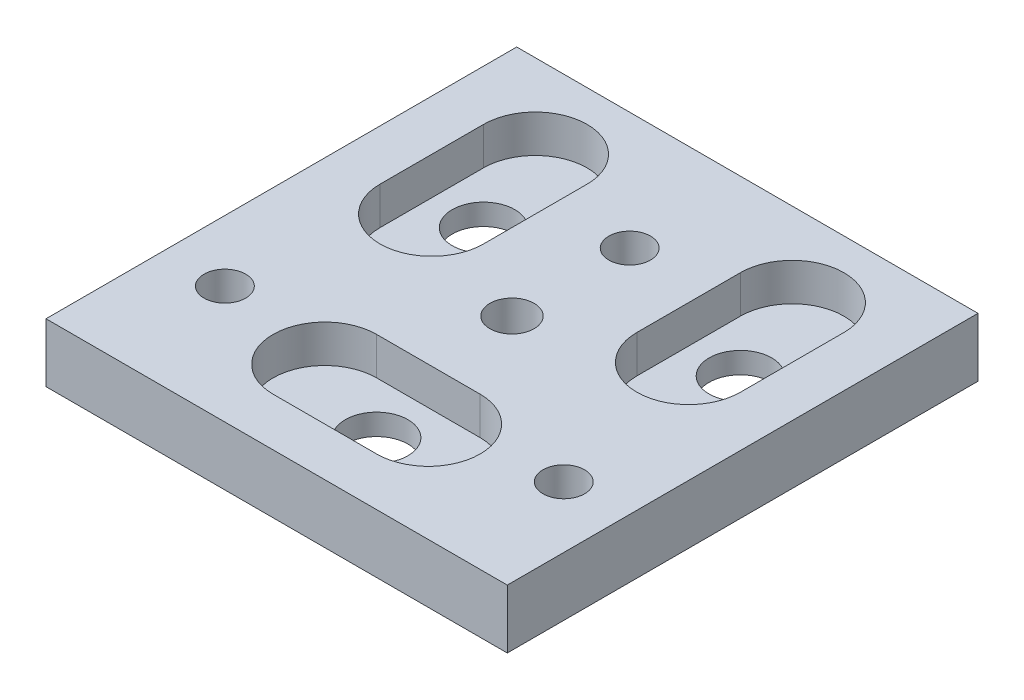
ISO-10303-21;
HEADER;
FILE_DESCRIPTION(('STEP AP214'),'2;1');
FILE_NAME('part.step','',(''),(''),'','','');
FILE_SCHEMA(('AUTOMOTIVE_DESIGN { 1 0 10303 214 1 1 1 1 }'));
ENDSEC;
DATA;
#1=APPLICATION_CONTEXT('core data for automotive mechanical design processes');
#2=APPLICATION_PROTOCOL_DEFINITION('international standard','automotive_design',2000,#1);
#3=PRODUCT_CONTEXT('',#1,'mechanical');
#4=PRODUCT('Part','Part','',(#3));
#5=PRODUCT_RELATED_PRODUCT_CATEGORY('part','',(#4));
#6=PRODUCT_DEFINITION_FORMATION('','',#4);
#7=PRODUCT_DEFINITION_CONTEXT('part definition',#1,'design');
#8=PRODUCT_DEFINITION('design','',#6,#7);
#9=PRODUCT_DEFINITION_SHAPE('','',#8);
#10=(LENGTH_UNIT() NAMED_UNIT(*) SI_UNIT(.MILLI.,.METRE.));
#11=(NAMED_UNIT(*) PLANE_ANGLE_UNIT() SI_UNIT($,.RADIAN.));
#12=(NAMED_UNIT(*) SI_UNIT($,.STERADIAN.) SOLID_ANGLE_UNIT());
#13=UNCERTAINTY_MEASURE_WITH_UNIT(LENGTH_MEASURE(1.E-05),#10,'distance_accuracy_value','');
#14=(GEOMETRIC_REPRESENTATION_CONTEXT(3) GLOBAL_UNCERTAINTY_ASSIGNED_CONTEXT((#13)) GLOBAL_UNIT_ASSIGNED_CONTEXT((#10,
#11,#12)) REPRESENTATION_CONTEXT('',''));
#15=CARTESIAN_POINT('',(0.,0.,0.));
#16=DIRECTION('',(0.,0.,1.));
#17=DIRECTION('',(1.,0.,0.));
#18=AXIS2_PLACEMENT_3D('',#15,#16,#17);
#19=CARTESIAN_POINT('',(0.,-1.01481323344643E-13,14.61008));
#20=DIRECTION('',(0.,-1.,0.));
#21=DIRECTION('',(0.,0.,-1.));
#22=AXIS2_PLACEMENT_3D('',#19,#20,#21);
#23=CYLINDRICAL_SURFACE('',#22,3.3782);
#24=CARTESIAN_POINT('',(0.,-1.01481323344643E-13,14.61008));
#25=DIRECTION('',(0.,-1.,0.));
#26=DIRECTION('',(0.,0.,-1.));
#27=AXIS2_PLACEMENT_3D('',#24,#25,#26);
#28=CIRCLE('',#27,3.3782);
#29=CARTESIAN_POINT('',(0.,0.,11.23188));
#30=VERTEX_POINT('',#29);
#31=EDGE_CURVE('E330',#30,#30,#28,.T.);
#32=ORIENTED_EDGE('',*,*,#31,.T.);
#33=EDGE_LOOP('',(#32));
#34=FACE_BOUND('',#33,.T.);
#35=CARTESIAN_POINT('',(0.,2.2859999999999,14.61008));
#36=DIRECTION('',(0.,1.,0.));
#37=DIRECTION('',(0.,0.,1.));
#38=AXIS2_PLACEMENT_3D('',#35,#36,#37);
#39=CIRCLE('',#38,3.3782);
#40=CARTESIAN_POINT('',(0.,2.28599999999987,17.98828));
#41=VERTEX_POINT('',#40);
#42=EDGE_CURVE('E46',#41,#41,#39,.F.);
#43=ORIENTED_EDGE('',*,*,#42,.F.);
#44=EDGE_LOOP('',(#43));
#45=FACE_BOUND('',#44,.T.);
#46=ADVANCED_FACE('F42',(#34,#45),#23,.F.);
#47=CARTESIAN_POINT('',(-24.892,-1.76074432811646E-13,25.4));
#48=DIRECTION('',(1.,0.,0.));
#49=DIRECTION('',(0.,0.,1.));
#50=AXIS2_PLACEMENT_3D('',#47,#48,#49);
#51=PLANE('',#50);
#52=DIRECTION('',(0.,0.,-1.));
#53=VECTOR('',#52,1.);
#54=CARTESIAN_POINT('',(-24.892,6.34999999999982,25.4));
#55=LINE('',#54,#53);
#56=CARTESIAN_POINT('',(-24.892,6.34999999999982,25.4));
#57=VERTEX_POINT('',#56);
#58=CARTESIAN_POINT('',(-24.892,6.35000000000018,-25.4));
#59=VERTEX_POINT('',#58);
#60=EDGE_CURVE('E371',#57,#59,#55,.T.);
#61=ORIENTED_EDGE('',*,*,#60,.T.);
#62=DIRECTION('',(0.,1.,0.));
#63=VECTOR('',#62,1.);
#64=CARTESIAN_POINT('',(-24.892,1.77809156287623E-13,-25.4));
#65=LINE('',#64,#63);
#66=CARTESIAN_POINT('',(-24.892,1.77809156287623E-13,-25.4));
#67=VERTEX_POINT('',#66);
#68=EDGE_CURVE('E12',#67,#59,#65,.T.);
#69=ORIENTED_EDGE('',*,*,#68,.F.);
#70=DIRECTION('',(0.,0.,-1.));
#71=VECTOR('',#70,1.);
#72=CARTESIAN_POINT('',(-24.892,-1.76074432811646E-13,25.4));
#73=LINE('',#72,#71);
#74=CARTESIAN_POINT('',(-24.892,-1.76074432811646E-13,25.4));
#75=VERTEX_POINT('',#74);
#76=EDGE_CURVE('E372',#75,#67,#73,.T.);
#77=ORIENTED_EDGE('',*,*,#76,.F.);
#78=DIRECTION('',(0.,1.,0.));
#79=VECTOR('',#78,1.);
#80=CARTESIAN_POINT('',(-24.892,-1.76074432811646E-13,25.4));
#81=LINE('',#80,#79);
#82=EDGE_CURVE('E386',#75,#57,#81,.T.);
#83=ORIENTED_EDGE('',*,*,#82,.T.);
#84=EDGE_LOOP('',(#61,#69,#77,#83));
#85=FACE_BOUND('',#84,.T.);
#86=ADVANCED_FACE('F44',(#85),#51,.F.);
#87=CARTESIAN_POINT('',(-24.892,1.77809156287623E-13,-25.4));
#88=DIRECTION('',(0.,0.,1.));
#89=DIRECTION('',(-1.,0.,0.));
#90=AXIS2_PLACEMENT_3D('',#87,#88,#89);
#91=PLANE('',#90);
#92=DIRECTION('',(1.,0.,0.));
#93=VECTOR('',#92,1.);
#94=CARTESIAN_POINT('',(-24.892,6.35000000000018,-25.4));
#95=LINE('',#94,#93);
#96=CARTESIAN_POINT('',(24.892,6.35000000000018,-25.4));
#97=VERTEX_POINT('',#96);
#98=EDGE_CURVE('E390',#59,#97,#95,.T.);
#99=ORIENTED_EDGE('',*,*,#98,.T.);
#100=DIRECTION('',(0.,1.,0.));
#101=VECTOR('',#100,1.);
#102=CARTESIAN_POINT('',(24.892,1.77809156287623E-13,-25.4));
#103=LINE('',#102,#101);
#104=CARTESIAN_POINT('',(24.892,1.77809156287623E-13,-25.4));
#105=VERTEX_POINT('',#104);
#106=EDGE_CURVE('E52',#105,#97,#103,.T.);
#107=ORIENTED_EDGE('',*,*,#106,.F.);
#108=DIRECTION('',(1.,0.,0.));
#109=VECTOR('',#108,1.);
#110=CARTESIAN_POINT('',(-24.892,1.77809156287623E-13,-25.4));
#111=LINE('',#110,#109);
#112=EDGE_CURVE('E376',#67,#105,#111,.T.);
#113=ORIENTED_EDGE('',*,*,#112,.F.);
#114=ORIENTED_EDGE('',*,*,#68,.T.);
#115=EDGE_LOOP('',(#99,#107,#113,#114));
#116=FACE_BOUND('',#115,.T.);
#117=ADVANCED_FACE('F440',(#116),#91,.F.);
#118=CARTESIAN_POINT('',(24.892,-1.76074432811646E-13,25.4));
#119=DIRECTION('',(-1.,0.,0.));
#120=DIRECTION('',(0.,0.,-1.));
#121=AXIS2_PLACEMENT_3D('',#118,#119,#120);
#122=PLANE('',#121);
#123=DIRECTION('',(0.,0.,1.));
#124=VECTOR('',#123,1.);
#125=CARTESIAN_POINT('',(24.892,6.34999999999982,25.4));
#126=LINE('',#125,#124);
#127=CARTESIAN_POINT('',(24.892,6.34999999999982,25.4));
#128=VERTEX_POINT('',#127);
#129=EDGE_CURVE('E393',#97,#128,#126,.T.);
#130=ORIENTED_EDGE('',*,*,#129,.T.);
#131=DIRECTION('',(0.,1.,0.));
#132=VECTOR('',#131,1.);
#133=CARTESIAN_POINT('',(24.892,-1.76074432811646E-13,25.4));
#134=LINE('',#133,#132);
#135=CARTESIAN_POINT('',(24.892,-1.76074432811646E-13,25.4));
#136=VERTEX_POINT('',#135);
#137=EDGE_CURVE('E401',#136,#128,#134,.T.);
#138=ORIENTED_EDGE('',*,*,#137,.F.);
#139=DIRECTION('',(0.,0.,1.));
#140=VECTOR('',#139,1.);
#141=CARTESIAN_POINT('',(24.892,-1.76074432811646E-13,25.4));
#142=LINE('',#141,#140);
#143=EDGE_CURVE('E380',#105,#136,#142,.T.);
#144=ORIENTED_EDGE('',*,*,#143,.F.);
#145=ORIENTED_EDGE('',*,*,#106,.T.);
#146=EDGE_LOOP('',(#130,#138,#144,#145));
#147=FACE_BOUND('',#146,.T.);
#148=ADVANCED_FACE('F476',(#147),#122,.F.);
#149=CARTESIAN_POINT('',(-24.892,-1.76074432811646E-13,25.4));
#150=DIRECTION('',(0.,0.,-1.));
#151=DIRECTION('',(1.,0.,0.));
#152=AXIS2_PLACEMENT_3D('',#149,#150,#151);
#153=PLANE('',#152);
#154=DIRECTION('',(-1.,0.,0.));
#155=VECTOR('',#154,1.);
#156=CARTESIAN_POINT('',(-24.892,6.34999999999982,25.4));
#157=LINE('',#156,#155);
#158=EDGE_CURVE('E377',#128,#57,#157,.T.);
#159=ORIENTED_EDGE('',*,*,#158,.T.);
#160=ORIENTED_EDGE('',*,*,#82,.F.);
#161=DIRECTION('',(-1.,0.,0.));
#162=VECTOR('',#161,1.);
#163=CARTESIAN_POINT('',(-24.892,-1.76074432811646E-13,25.4));
#164=LINE('',#163,#162);
#165=EDGE_CURVE('E383',#136,#75,#164,.T.);
#166=ORIENTED_EDGE('',*,*,#165,.F.);
#167=ORIENTED_EDGE('',*,*,#137,.T.);
#168=EDGE_LOOP('',(#159,#160,#166,#167));
#169=FACE_BOUND('',#168,.T.);
#170=ADVANCED_FACE('F469',(#169),#153,.F.);
#171=CARTESIAN_POINT('',(0.,0.,0.));
#172=DIRECTION('',(0.,-1.,0.));
#173=DIRECTION('',(0.,0.,-1.));
#174=AXIS2_PLACEMENT_3D('',#171,#172,#173);
#175=PLANE('',#174);
#176=CARTESIAN_POINT('',(0.,0.,0.));
#177=DIRECTION('',(0.,-1.,0.));
#178=DIRECTION('',(0.,0.,-1.));
#179=AXIS2_PLACEMENT_3D('',#176,#177,#178);
#180=CIRCLE('',#179,2.38125);
#181=CARTESIAN_POINT('',(0.,0.,-2.38125000000002));
#182=VERTEX_POINT('',#181);
#183=EDGE_CURVE('E205',#182,#182,#180,.T.);
#184=ORIENTED_EDGE('',*,*,#183,.F.);
#185=EDGE_LOOP('',(#184));
#186=FACE_BOUND('',#185,.T.);
#187=ORIENTED_EDGE('',*,*,#31,.F.);
#188=EDGE_LOOP('',(#187));
#189=FACE_BOUND('',#188,.T.);
#190=CARTESIAN_POINT('',(-13.86078,0.,-10.78992));
#191=DIRECTION('',(0.,-1.,0.));
#192=DIRECTION('',(0.,0.,-1.));
#193=AXIS2_PLACEMENT_3D('',#190,#191,#192);
#194=CIRCLE('',#193,3.3782);
#195=CARTESIAN_POINT('',(-13.86078,0.,-14.16812));
#196=VERTEX_POINT('',#195);
#197=EDGE_CURVE('E334',#196,#196,#194,.T.);
#198=ORIENTED_EDGE('',*,*,#197,.F.);
#199=EDGE_LOOP('',(#198));
#200=FACE_BOUND('',#199,.T.);
#201=CARTESIAN_POINT('',(13.86078,0.,-10.78992));
#202=DIRECTION('',(0.,-1.,0.));
#203=DIRECTION('',(0.,0.,-1.));
#204=AXIS2_PLACEMENT_3D('',#201,#202,#203);
#205=CIRCLE('',#204,3.3782);
#206=CARTESIAN_POINT('',(13.86078,0.,-14.16812));
#207=VERTEX_POINT('',#206);
#208=EDGE_CURVE('E338',#207,#207,#205,.T.);
#209=ORIENTED_EDGE('',*,*,#208,.F.);
#210=EDGE_LOOP('',(#209));
#211=FACE_BOUND('',#210,.T.);
#212=CARTESIAN_POINT('',(-18.288,0.,12.7));
#213=DIRECTION('',(0.,-1.,0.));
#214=DIRECTION('',(0.,0.,-1.));
#215=AXIS2_PLACEMENT_3D('',#212,#213,#214);
#216=CIRCLE('',#215,2.24789999999999);
#217=CARTESIAN_POINT('',(-18.288,0.,10.4521));
#218=VERTEX_POINT('',#217);
#219=EDGE_CURVE('E342',#218,#218,#216,.T.);
#220=ORIENTED_EDGE('',*,*,#219,.F.);
#221=EDGE_LOOP('',(#220));
#222=FACE_BOUND('',#221,.T.);
#223=CARTESIAN_POINT('',(18.288,0.,12.7));
#224=DIRECTION('',(0.,-1.,0.));
#225=DIRECTION('',(0.,0.,-1.));
#226=AXIS2_PLACEMENT_3D('',#223,#224,#225);
#227=CIRCLE('',#226,2.24789999999999);
#228=CARTESIAN_POINT('',(18.288,0.,10.4521));
#229=VERTEX_POINT('',#228);
#230=EDGE_CURVE('E351',#229,#229,#227,.T.);
#231=ORIENTED_EDGE('',*,*,#230,.F.);
#232=EDGE_LOOP('',(#231));
#233=FACE_BOUND('',#232,.T.);
#234=CARTESIAN_POINT('',(0.,0.,-12.7));
#235=DIRECTION('',(0.,-1.,0.));
#236=DIRECTION('',(0.,0.,-1.));
#237=AXIS2_PLACEMENT_3D('',#234,#235,#236);
#238=CIRCLE('',#237,2.24789999999999);
#239=CARTESIAN_POINT('',(0.,1.04167899077988E-13,-14.9479));
#240=VERTEX_POINT('',#239);
#241=EDGE_CURVE('E363',#240,#240,#238,.T.);
#242=ORIENTED_EDGE('',*,*,#241,.F.);
#243=EDGE_LOOP('',(#242));
#244=FACE_BOUND('',#243,.T.);
#245=ORIENTED_EDGE('',*,*,#76,.T.);
#246=ORIENTED_EDGE('',*,*,#112,.T.);
#247=ORIENTED_EDGE('',*,*,#143,.T.);
#248=ORIENTED_EDGE('',*,*,#165,.T.);
#249=EDGE_LOOP('',(#245,#246,#247,#248));
#250=FACE_BOUND('',#249,.T.);
#251=ADVANCED_FACE('F466',(#186,#189,#200,#211,#222,#233,#244,#250),#175,.T.);
#252=CARTESIAN_POINT('',(0.,6.35,0.));
#253=DIRECTION('',(0.,-1.,0.));
#254=DIRECTION('',(0.,0.,-1.));
#255=AXIS2_PLACEMENT_3D('',#252,#253,#254);
#256=PLANE('',#255);
#257=CARTESIAN_POINT('',(0.,6.35,0.));
#258=DIRECTION('',(0.,-1.,0.));
#259=DIRECTION('',(0.,0.,-1.));
#260=AXIS2_PLACEMENT_3D('',#257,#258,#259);
#261=CIRCLE('',#260,2.38125);
#262=CARTESIAN_POINT('',(0.,6.35000000000002,-2.38124999999998));
#263=VERTEX_POINT('',#262);
#264=EDGE_CURVE('E215',#263,#263,#261,.T.);
#265=ORIENTED_EDGE('',*,*,#264,.T.);
#266=EDGE_LOOP('',(#265));
#267=FACE_BOUND('',#266,.T.);
#268=DIRECTION('',(1.,0.,0.));
#269=VECTOR('',#268,1.);
#270=CARTESIAN_POINT('',(-5.588,6.34999999999986,20.19808));
#271=LINE('',#270,#269);
#272=CARTESIAN_POINT('',(-5.588,6.34999999999986,20.19808));
#273=VERTEX_POINT('',#272);
#274=CARTESIAN_POINT('',(5.588,6.34999999999986,20.19808));
#275=VERTEX_POINT('',#274);
#276=EDGE_CURVE('E214',#273,#275,#271,.T.);
#277=ORIENTED_EDGE('',*,*,#276,.F.);
#278=CARTESIAN_POINT('',(-5.588,6.3499999999999,14.61008));
#279=DIRECTION('',(0.,1.,0.));
#280=DIRECTION('',(0.,0.,1.));
#281=AXIS2_PLACEMENT_3D('',#278,#279,#280);
#282=CIRCLE('',#281,5.588);
#283=CARTESIAN_POINT('',(-5.588,6.34999999999994,9.02208000000002));
#284=VERTEX_POINT('',#283);
#285=EDGE_CURVE('E63',#284,#273,#282,.T.);
#286=ORIENTED_EDGE('',*,*,#285,.F.);
#287=DIRECTION('',(-1.,0.,0.));
#288=VECTOR('',#287,1.);
#289=CARTESIAN_POINT('',(-5.588,6.34999999999994,9.02208000000002));
#290=LINE('',#289,#288);
#291=CARTESIAN_POINT('',(5.588,6.34999999999994,9.02208000000002));
#292=VERTEX_POINT('',#291);
#293=EDGE_CURVE('E197',#292,#284,#290,.T.);
#294=ORIENTED_EDGE('',*,*,#293,.F.);
#295=CARTESIAN_POINT('',(5.588,6.3499999999999,14.61008));
#296=DIRECTION('',(0.,1.,0.));
#297=DIRECTION('',(0.,0.,-1.));
#298=AXIS2_PLACEMENT_3D('',#295,#296,#297);
#299=CIRCLE('',#298,5.588);
#300=EDGE_CURVE('E202',#275,#292,#299,.T.);
#301=ORIENTED_EDGE('',*,*,#300,.F.);
#302=EDGE_LOOP('',(#277,#286,#294,#301));
#303=FACE_BOUND('',#302,.T.);
#304=DIRECTION('',(0.,0.,1.));
#305=VECTOR('',#304,1.);
#306=CARTESIAN_POINT('',(8.27278,6.35000000000012,-16.37792));
#307=LINE('',#306,#305);
#308=CARTESIAN_POINT('',(8.27278,6.35000000000012,-16.37792));
#309=VERTEX_POINT('',#308);
#310=CARTESIAN_POINT('',(8.27278,6.35000000000004,-5.20191999999998));
#311=VERTEX_POINT('',#310);
#312=EDGE_CURVE('E256',#309,#311,#307,.T.);
#313=ORIENTED_EDGE('',*,*,#312,.F.);
#314=CARTESIAN_POINT('',(13.86078,6.35000000000012,-16.37792));
#315=DIRECTION('',(0.,1.,0.));
#316=DIRECTION('',(0.,0.,-1.));
#317=AXIS2_PLACEMENT_3D('',#314,#315,#316);
#318=CIRCLE('',#317,5.588);
#319=CARTESIAN_POINT('',(19.44878,6.35000000000012,-16.37792));
#320=VERTEX_POINT('',#319);
#321=EDGE_CURVE('E74',#320,#309,#318,.T.);
#322=ORIENTED_EDGE('',*,*,#321,.F.);
#323=DIRECTION('',(0.,0.,-1.));
#324=VECTOR('',#323,1.);
#325=CARTESIAN_POINT('',(19.44878,6.35000000000012,-16.37792));
#326=LINE('',#325,#324);
#327=CARTESIAN_POINT('',(19.44878,6.35000000000004,-5.20191999999998));
#328=VERTEX_POINT('',#327);
#329=EDGE_CURVE('E240',#328,#320,#326,.T.);
#330=ORIENTED_EDGE('',*,*,#329,.F.);
#331=CARTESIAN_POINT('',(13.86078,6.35000000000004,-5.20191999999998));
#332=DIRECTION('',(0.,1.,0.));
#333=DIRECTION('',(0.,0.,-1.));
#334=AXIS2_PLACEMENT_3D('',#331,#332,#333);
#335=CIRCLE('',#334,5.588);
#336=EDGE_CURVE('E266',#311,#328,#335,.T.);
#337=ORIENTED_EDGE('',*,*,#336,.F.);
#338=EDGE_LOOP('',(#313,#322,#330,#337));
#339=FACE_BOUND('',#338,.T.);
#340=DIRECTION('',(0.,0.,1.));
#341=VECTOR('',#340,1.);
#342=CARTESIAN_POINT('',(-19.44878,6.35000000000012,-16.37792));
#343=LINE('',#342,#341);
#344=CARTESIAN_POINT('',(-19.44878,6.35000000000012,-16.37792));
#345=VERTEX_POINT('',#344);
#346=CARTESIAN_POINT('',(-19.44878,6.35000000000004,-5.20191999999997));
#347=VERTEX_POINT('',#346);
#348=EDGE_CURVE('E302',#345,#347,#343,.T.);
#349=ORIENTED_EDGE('',*,*,#348,.F.);
#350=CARTESIAN_POINT('',(-13.86078,6.35000000000012,-16.37792));
#351=DIRECTION('',(0.,1.,0.));
#352=DIRECTION('',(0.,0.,-1.));
#353=AXIS2_PLACEMENT_3D('',#350,#351,#352);
#354=CIRCLE('',#353,5.588);
#355=CARTESIAN_POINT('',(-8.27278,6.35000000000012,-16.37792));
#356=VERTEX_POINT('',#355);
#357=EDGE_CURVE('E298',#356,#345,#354,.T.);
#358=ORIENTED_EDGE('',*,*,#357,.F.);
#359=DIRECTION('',(0.,0.,-1.));
#360=VECTOR('',#359,1.);
#361=CARTESIAN_POINT('',(-8.27278,6.35000000000012,-16.37792));
#362=LINE('',#361,#360);
#363=CARTESIAN_POINT('',(-8.27277999999999,6.35000000000004,-5.20191999999997));
#364=VERTEX_POINT('',#363);
#365=EDGE_CURVE('E285',#364,#356,#362,.T.);
#366=ORIENTED_EDGE('',*,*,#365,.F.);
#367=CARTESIAN_POINT('',(-13.86078,6.35000000000004,-5.20191999999997));
#368=DIRECTION('',(0.,1.,0.));
#369=DIRECTION('',(0.,0.,1.));
#370=AXIS2_PLACEMENT_3D('',#367,#368,#369);
#371=CIRCLE('',#370,5.588);
#372=EDGE_CURVE('E309',#347,#364,#371,.T.);
#373=ORIENTED_EDGE('',*,*,#372,.F.);
#374=EDGE_LOOP('',(#349,#358,#366,#373));
#375=FACE_BOUND('',#374,.T.);
#376=CARTESIAN_POINT('',(-18.288,6.34999999999991,12.7));
#377=DIRECTION('',(0.,-1.,0.));
#378=DIRECTION('',(0.,0.,-1.));
#379=AXIS2_PLACEMENT_3D('',#376,#377,#378);
#380=CIRCLE('',#379,2.2479);
#381=CARTESIAN_POINT('',(-18.288,6.34999999999993,10.4521));
#382=VERTEX_POINT('',#381);
#383=EDGE_CURVE('E346',#382,#382,#380,.T.);
#384=ORIENTED_EDGE('',*,*,#383,.T.);
#385=EDGE_LOOP('',(#384));
#386=FACE_BOUND('',#385,.T.);
#387=CARTESIAN_POINT('',(18.288,6.34999999999991,12.7));
#388=DIRECTION('',(0.,-1.,0.));
#389=DIRECTION('',(0.,0.,-1.));
#390=AXIS2_PLACEMENT_3D('',#387,#388,#389);
#391=CIRCLE('',#390,2.2479);
#392=CARTESIAN_POINT('',(18.288,6.34999999999993,10.4521));
#393=VERTEX_POINT('',#392);
#394=EDGE_CURVE('E358',#393,#393,#391,.T.);
#395=ORIENTED_EDGE('',*,*,#394,.T.);
#396=EDGE_LOOP('',(#395));
#397=FACE_BOUND('',#396,.T.);
#398=CARTESIAN_POINT('',(0.,6.35000000000009,-12.7));
#399=DIRECTION('',(0.,-1.,0.));
#400=DIRECTION('',(0.,0.,-1.));
#401=AXIS2_PLACEMENT_3D('',#398,#399,#400);
#402=CIRCLE('',#401,2.2479);
#403=CARTESIAN_POINT('',(0.,6.3500000000001,-14.9479));
#404=VERTEX_POINT('',#403);
#405=EDGE_CURVE('E366',#404,#404,#402,.T.);
#406=ORIENTED_EDGE('',*,*,#405,.T.);
#407=EDGE_LOOP('',(#406));
#408=FACE_BOUND('',#407,.T.);
#409=ORIENTED_EDGE('',*,*,#60,.F.);
#410=ORIENTED_EDGE('',*,*,#158,.F.);
#411=ORIENTED_EDGE('',*,*,#129,.F.);
#412=ORIENTED_EDGE('',*,*,#98,.F.);
#413=EDGE_LOOP('',(#409,#410,#411,#412));
#414=FACE_BOUND('',#413,.T.);
#415=ADVANCED_FACE('F464',(#267,#303,#339,#375,#386,#397,#408,#414),#256,.F.);
#416=CARTESIAN_POINT('',(0.,0.,-12.7));
#417=DIRECTION('',(0.,-1.,0.));
#418=DIRECTION('',(0.,0.,-1.));
#419=AXIS2_PLACEMENT_3D('',#416,#417,#418);
#420=CYLINDRICAL_SURFACE('',#419,2.24789999999999);
#421=ORIENTED_EDGE('',*,*,#405,.F.);
#422=EDGE_LOOP('',(#421));
#423=FACE_BOUND('',#422,.T.);
#424=ORIENTED_EDGE('',*,*,#241,.T.);
#425=EDGE_LOOP('',(#424));
#426=FACE_BOUND('',#425,.T.);
#427=ADVANCED_FACE('F460',(#423,#426),#420,.F.);
#428=CARTESIAN_POINT('',(18.288,0.,12.7));
#429=DIRECTION('',(0.,-1.,0.));
#430=DIRECTION('',(0.,0.,-1.));
#431=AXIS2_PLACEMENT_3D('',#428,#429,#430);
#432=CYLINDRICAL_SURFACE('',#431,2.24789999999999);
#433=ORIENTED_EDGE('',*,*,#394,.F.);
#434=EDGE_LOOP('',(#433));
#435=FACE_BOUND('',#434,.T.);
#436=ORIENTED_EDGE('',*,*,#230,.T.);
#437=EDGE_LOOP('',(#436));
#438=FACE_BOUND('',#437,.T.);
#439=ADVANCED_FACE('F456',(#435,#438),#432,.F.);
#440=CARTESIAN_POINT('',(-18.288,0.,12.7));
#441=DIRECTION('',(0.,-1.,0.));
#442=DIRECTION('',(0.,0.,-1.));
#443=AXIS2_PLACEMENT_3D('',#440,#441,#442);
#444=CYLINDRICAL_SURFACE('',#443,2.24789999999999);
#445=ORIENTED_EDGE('',*,*,#383,.F.);
#446=EDGE_LOOP('',(#445));
#447=FACE_BOUND('',#446,.T.);
#448=ORIENTED_EDGE('',*,*,#219,.T.);
#449=EDGE_LOOP('',(#448));
#450=FACE_BOUND('',#449,.T.);
#451=ADVANCED_FACE('F453',(#447,#450),#444,.F.);
#452=CARTESIAN_POINT('',(13.86078,0.,-10.78992));
#453=DIRECTION('',(0.,-1.,0.));
#454=DIRECTION('',(0.,0.,-1.));
#455=AXIS2_PLACEMENT_3D('',#452,#453,#454);
#456=CYLINDRICAL_SURFACE('',#455,3.3782);
#457=CARTESIAN_POINT('',(13.86078,2.28600000000008,-10.78992));
#458=DIRECTION('',(0.,-1.,0.));
#459=DIRECTION('',(0.,0.,-1.));
#460=AXIS2_PLACEMENT_3D('',#457,#458,#459);
#461=CIRCLE('',#460,3.3782);
#462=CARTESIAN_POINT('',(13.86078,2.2860000000001,-14.16812));
#463=VERTEX_POINT('',#462);
#464=EDGE_CURVE('E271',#463,#463,#461,.F.);
#465=ORIENTED_EDGE('',*,*,#464,.T.);
#466=EDGE_LOOP('',(#465));
#467=FACE_BOUND('',#466,.T.);
#468=ORIENTED_EDGE('',*,*,#208,.T.);
#469=EDGE_LOOP('',(#468));
#470=FACE_BOUND('',#469,.T.);
#471=ADVANCED_FACE('F414',(#467,#470),#456,.F.);
#472=CARTESIAN_POINT('',(-13.86078,0.,-10.78992));
#473=DIRECTION('',(0.,-1.,0.));
#474=DIRECTION('',(0.,0.,-1.));
#475=AXIS2_PLACEMENT_3D('',#472,#473,#474);
#476=CYLINDRICAL_SURFACE('',#475,3.3782);
#477=CARTESIAN_POINT('',(-13.86078,2.28600000000008,-10.78992));
#478=DIRECTION('',(0.,-1.,0.));
#479=DIRECTION('',(0.,0.,-1.));
#480=AXIS2_PLACEMENT_3D('',#477,#478,#479);
#481=CIRCLE('',#480,3.3782);
#482=CARTESIAN_POINT('',(-13.86078,2.2860000000001,-14.16812));
#483=VERTEX_POINT('',#482);
#484=EDGE_CURVE('E320',#483,#483,#481,.F.);
#485=ORIENTED_EDGE('',*,*,#484,.T.);
#486=EDGE_LOOP('',(#485));
#487=FACE_BOUND('',#486,.T.);
#488=ORIENTED_EDGE('',*,*,#197,.T.);
#489=EDGE_LOOP('',(#488));
#490=FACE_BOUND('',#489,.T.);
#491=ADVANCED_FACE('F446',(#487,#490),#476,.F.);
#492=CARTESIAN_POINT('',(-13.86078,2.28600000000012,-16.37792));
#493=DIRECTION('',(0.,-1.,0.));
#494=DIRECTION('',(0.,0.,-1.));
#495=AXIS2_PLACEMENT_3D('',#492,#493,#494);
#496=PLANE('',#495);
#497=CARTESIAN_POINT('',(-13.86078,2.28600000000012,-16.37792));
#498=DIRECTION('',(0.,1.,0.));
#499=DIRECTION('',(0.,0.,-1.));
#500=AXIS2_PLACEMENT_3D('',#497,#498,#499);
#501=CIRCLE('',#500,5.588);
#502=CARTESIAN_POINT('',(-8.27278,2.28600000000012,-16.37792));
#503=VERTEX_POINT('',#502);
#504=CARTESIAN_POINT('',(-19.44878,2.28600000000012,-16.37792));
#505=VERTEX_POINT('',#504);
#506=EDGE_CURVE('E280',#503,#505,#501,.T.);
#507=ORIENTED_EDGE('',*,*,#506,.T.);
#508=DIRECTION('',(0.,0.,1.));
#509=VECTOR('',#508,1.);
#510=CARTESIAN_POINT('',(-19.44878,2.28600000000012,-16.37792));
#511=LINE('',#510,#509);
#512=CARTESIAN_POINT('',(-19.44878,2.28600000000004,-5.20192));
#513=VERTEX_POINT('',#512);
#514=EDGE_CURVE('E284',#505,#513,#511,.T.);
#515=ORIENTED_EDGE('',*,*,#514,.T.);
#516=CARTESIAN_POINT('',(-13.86078,2.28600000000004,-5.20192));
#517=DIRECTION('',(0.,1.,0.));
#518=DIRECTION('',(0.,0.,1.));
#519=AXIS2_PLACEMENT_3D('',#516,#517,#518);
#520=CIRCLE('',#519,5.588);
#521=CARTESIAN_POINT('',(-8.27277999999999,2.28600000000004,-5.20192));
#522=VERTEX_POINT('',#521);
#523=EDGE_CURVE('E289',#513,#522,#520,.T.);
#524=ORIENTED_EDGE('',*,*,#523,.T.);
#525=DIRECTION('',(0.,0.,-1.));
#526=VECTOR('',#525,1.);
#527=CARTESIAN_POINT('',(-8.27278,2.28600000000012,-16.37792));
#528=LINE('',#527,#526);
#529=EDGE_CURVE('E293',#522,#503,#528,.T.);
#530=ORIENTED_EDGE('',*,*,#529,.T.);
#531=EDGE_LOOP('',(#507,#515,#524,#530));
#532=FACE_BOUND('',#531,.T.);
#533=ORIENTED_EDGE('',*,*,#484,.F.);
#534=EDGE_LOOP('',(#533));
#535=FACE_BOUND('',#534,.T.);
#536=ADVANCED_FACE('F449',(#532,#535),#496,.F.);
#537=CARTESIAN_POINT('',(-13.86078,2.28600000000012,-16.37792));
#538=DIRECTION('',(0.,1.,0.));
#539=DIRECTION('',(0.,0.,1.));
#540=AXIS2_PLACEMENT_3D('',#537,#538,#539);
#541=CYLINDRICAL_SURFACE('',#540,5.588);
#542=ORIENTED_EDGE('',*,*,#357,.T.);
#543=DIRECTION('',(0.,1.,0.));
#544=VECTOR('',#543,1.);
#545=CARTESIAN_POINT('',(-19.44878,2.28600000000012,-16.37792));
#546=LINE('',#545,#544);
#547=EDGE_CURVE('E297',#505,#345,#546,.T.);
#548=ORIENTED_EDGE('',*,*,#547,.F.);
#549=ORIENTED_EDGE('',*,*,#506,.F.);
#550=DIRECTION('',(0.,1.,0.));
#551=VECTOR('',#550,1.);
#552=CARTESIAN_POINT('',(-8.27278,2.28600000000012,-16.37792));
#553=LINE('',#552,#551);
#554=EDGE_CURVE('E317',#503,#356,#553,.T.);
#555=ORIENTED_EDGE('',*,*,#554,.T.);
#556=EDGE_LOOP('',(#542,#548,#549,#555));
#557=FACE_BOUND('',#556,.T.);
#558=ADVANCED_FACE('F445',(#557),#541,.F.);
#559=CARTESIAN_POINT('',(-8.27278,2.28600000000012,-16.37792));
#560=DIRECTION('',(1.,0.,0.));
#561=DIRECTION('',(0.,0.,1.));
#562=AXIS2_PLACEMENT_3D('',#559,#560,#561);
#563=PLANE('',#562);
#564=ORIENTED_EDGE('',*,*,#365,.T.);
#565=ORIENTED_EDGE('',*,*,#554,.F.);
#566=ORIENTED_EDGE('',*,*,#529,.F.);
#567=DIRECTION('',(0.,1.,0.));
#568=VECTOR('',#567,1.);
#569=CARTESIAN_POINT('',(-8.27277999999999,2.28600000000004,-5.20192));
#570=LINE('',#569,#568);
#571=EDGE_CURVE('E321',#522,#364,#570,.T.);
#572=ORIENTED_EDGE('',*,*,#571,.T.);
#573=EDGE_LOOP('',(#564,#565,#566,#572));
#574=FACE_BOUND('',#573,.T.);
#575=ADVANCED_FACE('F547',(#574),#563,.F.);
#576=CARTESIAN_POINT('',(-13.86078,2.28600000000004,-5.20192));
#577=DIRECTION('',(0.,1.,0.));
#578=DIRECTION('',(0.,0.,1.));
#579=AXIS2_PLACEMENT_3D('',#576,#577,#578);
#580=CYLINDRICAL_SURFACE('',#579,5.588);
#581=ORIENTED_EDGE('',*,*,#372,.T.);
#582=ORIENTED_EDGE('',*,*,#571,.F.);
#583=ORIENTED_EDGE('',*,*,#523,.F.);
#584=DIRECTION('',(0.,1.,0.));
#585=VECTOR('',#584,1.);
#586=CARTESIAN_POINT('',(-19.44878,2.28600000000004,-5.20192));
#587=LINE('',#586,#585);
#588=EDGE_CURVE('E324',#513,#347,#587,.T.);
#589=ORIENTED_EDGE('',*,*,#588,.T.);
#590=EDGE_LOOP('',(#581,#582,#583,#589));
#591=FACE_BOUND('',#590,.T.);
#592=ADVANCED_FACE('F429',(#591),#580,.F.);
#593=CARTESIAN_POINT('',(-19.44878,2.28600000000012,-16.37792));
#594=DIRECTION('',(-1.,0.,0.));
#595=DIRECTION('',(0.,0.,-1.));
#596=AXIS2_PLACEMENT_3D('',#593,#594,#595);
#597=PLANE('',#596);
#598=ORIENTED_EDGE('',*,*,#348,.T.);
#599=ORIENTED_EDGE('',*,*,#588,.F.);
#600=ORIENTED_EDGE('',*,*,#514,.F.);
#601=ORIENTED_EDGE('',*,*,#547,.T.);
#602=EDGE_LOOP('',(#598,#599,#600,#601));
#603=FACE_BOUND('',#602,.T.);
#604=ADVANCED_FACE('F420',(#603),#597,.F.);
#605=CARTESIAN_POINT('',(13.86078,2.28600000000012,-16.37792));
#606=DIRECTION('',(0.,-1.,0.));
#607=DIRECTION('',(0.,0.,-1.));
#608=AXIS2_PLACEMENT_3D('',#605,#606,#607);
#609=PLANE('',#608);
#610=CARTESIAN_POINT('',(13.86078,2.28600000000012,-16.37792));
#611=DIRECTION('',(0.,1.,0.));
#612=DIRECTION('',(0.,0.,-1.));
#613=AXIS2_PLACEMENT_3D('',#610,#611,#612);
#614=CIRCLE('',#613,5.588);
#615=CARTESIAN_POINT('',(19.44878,2.28600000000012,-16.37792));
#616=VERTEX_POINT('',#615);
#617=CARTESIAN_POINT('',(8.27278,2.28600000000012,-16.37792));
#618=VERTEX_POINT('',#617);
#619=EDGE_CURVE('E235',#616,#618,#614,.T.);
#620=ORIENTED_EDGE('',*,*,#619,.T.);
#621=DIRECTION('',(0.,0.,1.));
#622=VECTOR('',#621,1.);
#623=CARTESIAN_POINT('',(8.27278,2.28600000000012,-16.37792));
#624=LINE('',#623,#622);
#625=CARTESIAN_POINT('',(8.27278,2.28600000000004,-5.20192000000001));
#626=VERTEX_POINT('',#625);
#627=EDGE_CURVE('E239',#618,#626,#624,.T.);
#628=ORIENTED_EDGE('',*,*,#627,.T.);
#629=CARTESIAN_POINT('',(13.86078,2.28600000000004,-5.20192000000001));
#630=DIRECTION('',(0.,1.,0.));
#631=DIRECTION('',(0.,0.,-1.));
#632=AXIS2_PLACEMENT_3D('',#629,#630,#631);
#633=CIRCLE('',#632,5.588);
#634=CARTESIAN_POINT('',(19.44878,2.28600000000004,-5.20192000000001));
#635=VERTEX_POINT('',#634);
#636=EDGE_CURVE('E244',#626,#635,#633,.T.);
#637=ORIENTED_EDGE('',*,*,#636,.T.);
#638=DIRECTION('',(0.,0.,-1.));
#639=VECTOR('',#638,1.);
#640=CARTESIAN_POINT('',(19.44878,2.28600000000012,-16.37792));
#641=LINE('',#640,#639);
#642=EDGE_CURVE('E248',#635,#616,#641,.T.);
#643=ORIENTED_EDGE('',*,*,#642,.T.);
#644=EDGE_LOOP('',(#620,#628,#637,#643));
#645=FACE_BOUND('',#644,.T.);
#646=ORIENTED_EDGE('',*,*,#464,.F.);
#647=EDGE_LOOP('',(#646));
#648=FACE_BOUND('',#647,.T.);
#649=ADVANCED_FACE('F417',(#645,#648),#609,.F.);
#650=CARTESIAN_POINT('',(13.86078,2.28600000000012,-16.37792));
#651=DIRECTION('',(0.,1.,0.));
#652=DIRECTION('',(0.,0.,1.));
#653=AXIS2_PLACEMENT_3D('',#650,#651,#652);
#654=CYLINDRICAL_SURFACE('',#653,5.588);
#655=ORIENTED_EDGE('',*,*,#321,.T.);
#656=DIRECTION('',(0.,1.,0.));
#657=VECTOR('',#656,1.);
#658=CARTESIAN_POINT('',(8.27278,2.28600000000012,-16.37792));
#659=LINE('',#658,#657);
#660=EDGE_CURVE('E252',#618,#309,#659,.T.);
#661=ORIENTED_EDGE('',*,*,#660,.F.);
#662=ORIENTED_EDGE('',*,*,#619,.F.);
#663=DIRECTION('',(0.,1.,0.));
#664=VECTOR('',#663,1.);
#665=CARTESIAN_POINT('',(19.44878,2.28600000000012,-16.37792));
#666=LINE('',#665,#664);
#667=EDGE_CURVE('E268',#616,#320,#666,.T.);
#668=ORIENTED_EDGE('',*,*,#667,.T.);
#669=EDGE_LOOP('',(#655,#661,#662,#668));
#670=FACE_BOUND('',#669,.T.);
#671=ADVANCED_FACE('F419',(#670),#654,.F.);
#672=CARTESIAN_POINT('',(19.44878,2.28600000000012,-16.37792));
#673=DIRECTION('',(1.,0.,0.));
#674=DIRECTION('',(0.,0.,1.));
#675=AXIS2_PLACEMENT_3D('',#672,#673,#674);
#676=PLANE('',#675);
#677=ORIENTED_EDGE('',*,*,#329,.T.);
#678=ORIENTED_EDGE('',*,*,#667,.F.);
#679=ORIENTED_EDGE('',*,*,#642,.F.);
#680=DIRECTION('',(0.,1.,0.));
#681=VECTOR('',#680,1.);
#682=CARTESIAN_POINT('',(19.44878,2.28600000000004,-5.20192000000001));
#683=LINE('',#682,#681);
#684=EDGE_CURVE('E272',#635,#328,#683,.T.);
#685=ORIENTED_EDGE('',*,*,#684,.T.);
#686=EDGE_LOOP('',(#677,#678,#679,#685));
#687=FACE_BOUND('',#686,.T.);
#688=ADVANCED_FACE('F427',(#687),#676,.F.);
#689=CARTESIAN_POINT('',(13.86078,2.28600000000004,-5.20192000000001));
#690=DIRECTION('',(0.,1.,0.));
#691=DIRECTION('',(0.,0.,1.));
#692=AXIS2_PLACEMENT_3D('',#689,#690,#691);
#693=CYLINDRICAL_SURFACE('',#692,5.588);
#694=ORIENTED_EDGE('',*,*,#336,.T.);
#695=ORIENTED_EDGE('',*,*,#684,.F.);
#696=ORIENTED_EDGE('',*,*,#636,.F.);
#697=DIRECTION('',(0.,1.,0.));
#698=VECTOR('',#697,1.);
#699=CARTESIAN_POINT('',(8.27278,2.28600000000004,-5.20192000000001));
#700=LINE('',#699,#698);
#701=EDGE_CURVE('E275',#626,#311,#700,.T.);
#702=ORIENTED_EDGE('',*,*,#701,.T.);
#703=EDGE_LOOP('',(#694,#695,#696,#702));
#704=FACE_BOUND('',#703,.T.);
#705=ADVANCED_FACE('F586',(#704),#693,.F.);
#706=CARTESIAN_POINT('',(8.27278,2.28600000000012,-16.37792));
#707=DIRECTION('',(-1.,0.,0.));
#708=DIRECTION('',(0.,0.,-1.));
#709=AXIS2_PLACEMENT_3D('',#706,#707,#708);
#710=PLANE('',#709);
#711=ORIENTED_EDGE('',*,*,#312,.T.);
#712=ORIENTED_EDGE('',*,*,#701,.F.);
#713=ORIENTED_EDGE('',*,*,#627,.F.);
#714=ORIENTED_EDGE('',*,*,#660,.T.);
#715=EDGE_LOOP('',(#711,#712,#713,#714));
#716=FACE_BOUND('',#715,.T.);
#717=ADVANCED_FACE('F595',(#716),#710,.F.);
#718=CARTESIAN_POINT('',(-5.588,2.2859999999999,14.61008));
#719=DIRECTION('',(0.,1.,0.));
#720=DIRECTION('',(0.,0.,1.));
#721=AXIS2_PLACEMENT_3D('',#718,#719,#720);
#722=PLANE('',#721);
#723=CARTESIAN_POINT('',(-5.588,2.2859999999999,14.61008));
#724=DIRECTION('',(0.,1.,0.));
#725=DIRECTION('',(0.,0.,1.));
#726=AXIS2_PLACEMENT_3D('',#723,#724,#725);
#727=CIRCLE('',#726,5.588);
#728=CARTESIAN_POINT('',(-5.588,2.28599999999994,9.02208));
#729=VERTEX_POINT('',#728);
#730=CARTESIAN_POINT('',(-5.588,2.28599999999986,20.19808));
#731=VERTEX_POINT('',#730);
#732=EDGE_CURVE('E175',#729,#731,#727,.T.);
#733=ORIENTED_EDGE('',*,*,#732,.T.);
#734=DIRECTION('',(1.,0.,0.));
#735=VECTOR('',#734,1.);
#736=CARTESIAN_POINT('',(-5.588,2.28599999999986,20.19808));
#737=LINE('',#736,#735);
#738=CARTESIAN_POINT('',(5.588,2.28599999999986,20.19808));
#739=VERTEX_POINT('',#738);
#740=EDGE_CURVE('E185',#731,#739,#737,.T.);
#741=ORIENTED_EDGE('',*,*,#740,.T.);
#742=CARTESIAN_POINT('',(5.588,2.2859999999999,14.61008));
#743=DIRECTION('',(0.,1.,0.));
#744=DIRECTION('',(0.,0.,-1.));
#745=AXIS2_PLACEMENT_3D('',#742,#743,#744);
#746=CIRCLE('',#745,5.588);
#747=CARTESIAN_POINT('',(5.588,2.28599999999994,9.02208));
#748=VERTEX_POINT('',#747);
#749=EDGE_CURVE('E191',#739,#748,#746,.T.);
#750=ORIENTED_EDGE('',*,*,#749,.T.);
#751=DIRECTION('',(-1.,0.,0.));
#752=VECTOR('',#751,1.);
#753=CARTESIAN_POINT('',(-5.588,2.28599999999994,9.02208));
#754=LINE('',#753,#752);
#755=EDGE_CURVE('E182',#748,#729,#754,.T.);
#756=ORIENTED_EDGE('',*,*,#755,.T.);
#757=EDGE_LOOP('',(#733,#741,#750,#756));
#758=FACE_BOUND('',#757,.T.);
#759=ORIENTED_EDGE('',*,*,#42,.T.);
#760=EDGE_LOOP('',(#759));
#761=FACE_BOUND('',#760,.T.);
#762=ADVANCED_FACE('F193',(#758,#761),#722,.T.);
#763=CARTESIAN_POINT('',(-5.588,2.2859999999999,14.61008));
#764=DIRECTION('',(0.,1.,0.));
#765=DIRECTION('',(0.,0.,1.));
#766=AXIS2_PLACEMENT_3D('',#763,#764,#765);
#767=CYLINDRICAL_SURFACE('',#766,5.588);
#768=ORIENTED_EDGE('',*,*,#285,.T.);
#769=DIRECTION('',(0.,1.,0.));
#770=VECTOR('',#769,1.);
#771=CARTESIAN_POINT('',(-5.588,2.28599999999986,20.19808));
#772=LINE('',#771,#770);
#773=EDGE_CURVE('E171',#731,#273,#772,.T.);
#774=ORIENTED_EDGE('',*,*,#773,.F.);
#775=ORIENTED_EDGE('',*,*,#732,.F.);
#776=DIRECTION('',(0.,1.,0.));
#777=VECTOR('',#776,1.);
#778=CARTESIAN_POINT('',(-5.588,2.28599999999994,9.02208));
#779=LINE('',#778,#777);
#780=EDGE_CURVE('E227',#729,#284,#779,.T.);
#781=ORIENTED_EDGE('',*,*,#780,.T.);
#782=EDGE_LOOP('',(#768,#774,#775,#781));
#783=FACE_BOUND('',#782,.T.);
#784=ADVANCED_FACE('F173',(#783),#767,.F.);
#785=CARTESIAN_POINT('',(-5.588,2.28599999999994,9.02208));
#786=DIRECTION('',(0.,0.,-1.));
#787=DIRECTION('',(1.,0.,0.));
#788=AXIS2_PLACEMENT_3D('',#785,#786,#787);
#789=PLANE('',#788);
#790=ORIENTED_EDGE('',*,*,#293,.T.);
#791=ORIENTED_EDGE('',*,*,#780,.F.);
#792=ORIENTED_EDGE('',*,*,#755,.F.);
#793=DIRECTION('',(0.,1.,0.));
#794=VECTOR('',#793,1.);
#795=CARTESIAN_POINT('',(5.588,2.28599999999994,9.02208));
#796=LINE('',#795,#794);
#797=EDGE_CURVE('E230',#748,#292,#796,.T.);
#798=ORIENTED_EDGE('',*,*,#797,.T.);
#799=EDGE_LOOP('',(#790,#791,#792,#798));
#800=FACE_BOUND('',#799,.T.);
#801=ADVANCED_FACE('F622',(#800),#789,.F.);
#802=CARTESIAN_POINT('',(5.588,2.2859999999999,14.61008));
#803=DIRECTION('',(0.,1.,0.));
#804=DIRECTION('',(0.,0.,1.));
#805=AXIS2_PLACEMENT_3D('',#802,#803,#804);
#806=CYLINDRICAL_SURFACE('',#805,5.588);
#807=ORIENTED_EDGE('',*,*,#300,.T.);
#808=ORIENTED_EDGE('',*,*,#797,.F.);
#809=ORIENTED_EDGE('',*,*,#749,.F.);
#810=DIRECTION('',(0.,1.,0.));
#811=VECTOR('',#810,1.);
#812=CARTESIAN_POINT('',(5.588,2.28599999999986,20.19808));
#813=LINE('',#812,#811);
#814=EDGE_CURVE('E181',#739,#275,#813,.T.);
#815=ORIENTED_EDGE('',*,*,#814,.T.);
#816=EDGE_LOOP('',(#807,#808,#809,#815));
#817=FACE_BOUND('',#816,.T.);
#818=ADVANCED_FACE('F630',(#817),#806,.F.);
#819=CARTESIAN_POINT('',(-5.588,2.28599999999986,20.19808));
#820=DIRECTION('',(0.,0.,1.));
#821=DIRECTION('',(-1.,0.,0.));
#822=AXIS2_PLACEMENT_3D('',#819,#820,#821);
#823=PLANE('',#822);
#824=ORIENTED_EDGE('',*,*,#276,.T.);
#825=ORIENTED_EDGE('',*,*,#814,.F.);
#826=ORIENTED_EDGE('',*,*,#740,.F.);
#827=ORIENTED_EDGE('',*,*,#773,.T.);
#828=EDGE_LOOP('',(#824,#825,#826,#827));
#829=FACE_BOUND('',#828,.T.);
#830=ADVANCED_FACE('F186',(#829),#823,.F.);
#831=CARTESIAN_POINT('',(0.,6.35,0.));
#832=DIRECTION('',(0.,-1.,0.));
#833=DIRECTION('',(0.,0.,-1.));
#834=AXIS2_PLACEMENT_3D('',#831,#832,#833);
#835=CYLINDRICAL_SURFACE('',#834,2.38125);
#836=ORIENTED_EDGE('',*,*,#264,.F.);
#837=EDGE_LOOP('',(#836));
#838=FACE_BOUND('',#837,.T.);
#839=ORIENTED_EDGE('',*,*,#183,.T.);
#840=EDGE_LOOP('',(#839));
#841=FACE_BOUND('',#840,.T.);
#842=ADVANCED_FACE('F649',(#838,#841),#835,.F.);
#843=CLOSED_SHELL('',(#46,#86,#117,#148,#170,#251,#415,#427,#439,#451,#471,#491,#536,#558,#575,
#592,#604,#649,#671,#688,#705,#717,#762,#784,#801,#818,#830,#842));
#844=MANIFOLD_SOLID_BREP('B2',#843);
#845=ADVANCED_BREP_SHAPE_REPRESENTATION('',(#18,#844),#14);
#846=SHAPE_DEFINITION_REPRESENTATION(#9,#845);
ENDSEC;
END-ISO-10303-21;
